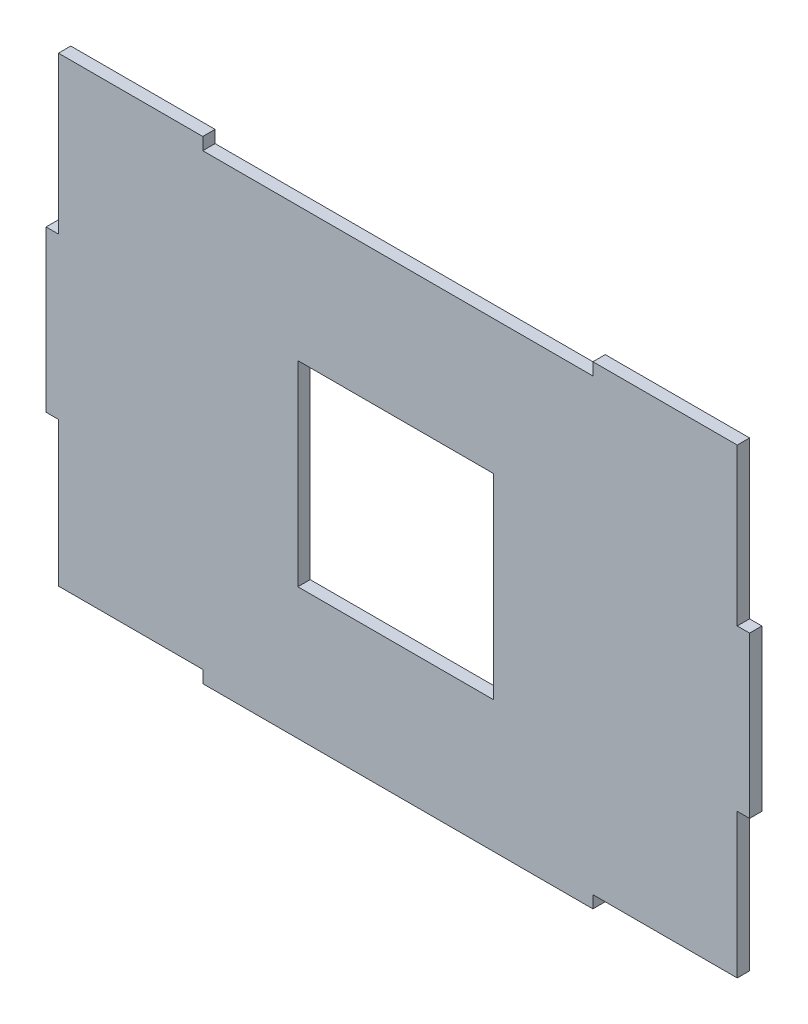
ISO-10303-21;
HEADER;
FILE_DESCRIPTION(('STEP AP214'),'2;1');
FILE_NAME('part.step','',(''),(''),'','','');
FILE_SCHEMA(('AUTOMOTIVE_DESIGN { 1 0 10303 214 1 1 1 1 }'));
ENDSEC;
DATA;
#1=APPLICATION_CONTEXT('core data for automotive mechanical design processes');
#2=APPLICATION_PROTOCOL_DEFINITION('international standard','automotive_design',2000,#1);
#3=PRODUCT_CONTEXT('',#1,'mechanical');
#4=PRODUCT('Part','Part','',(#3));
#5=PRODUCT_RELATED_PRODUCT_CATEGORY('part','',(#4));
#6=PRODUCT_DEFINITION_FORMATION('','',#4);
#7=PRODUCT_DEFINITION_CONTEXT('part definition',#1,'design');
#8=PRODUCT_DEFINITION('design','',#6,#7);
#9=PRODUCT_DEFINITION_SHAPE('','',#8);
#10=(LENGTH_UNIT() NAMED_UNIT(*) SI_UNIT(.MILLI.,.METRE.));
#11=(NAMED_UNIT(*) PLANE_ANGLE_UNIT() SI_UNIT($,.RADIAN.));
#12=(NAMED_UNIT(*) SI_UNIT($,.STERADIAN.) SOLID_ANGLE_UNIT());
#13=UNCERTAINTY_MEASURE_WITH_UNIT(LENGTH_MEASURE(1.E-05),#10,'distance_accuracy_value','');
#14=(GEOMETRIC_REPRESENTATION_CONTEXT(3) GLOBAL_UNCERTAINTY_ASSIGNED_CONTEXT((#13)) GLOBAL_UNIT_ASSIGNED_CONTEXT((#10,
#11,#12)) REPRESENTATION_CONTEXT('',''));
#15=CARTESIAN_POINT('',(0.,0.,0.));
#16=DIRECTION('',(0.,0.,1.));
#17=DIRECTION('',(1.,0.,0.));
#18=AXIS2_PLACEMENT_3D('',#15,#16,#17);
#19=CARTESIAN_POINT('',(0.,0.,2.));
#20=DIRECTION('',(0.,0.,-1.));
#21=DIRECTION('',(-1.,0.,0.));
#22=AXIS2_PLACEMENT_3D('',#19,#20,#21);
#23=PLANE('',#22);
#24=DIRECTION('',(0.,1.,0.));
#25=VECTOR('',#24,1.);
#26=CARTESIAN_POINT('',(55.023,35.465,2.));
#27=LINE('',#26,#25);
#28=CARTESIAN_POINT('',(55.023,12.065,2.));
#29=VERTEX_POINT('',#28);
#30=CARTESIAN_POINT('',(55.023,37.465,2.));
#31=VERTEX_POINT('',#30);
#32=EDGE_CURVE('E253',#29,#31,#27,.T.);
#33=ORIENTED_EDGE('',*,*,#32,.T.);
#34=DIRECTION('',(-1.,0.,0.));
#35=VECTOR('',#34,1.);
#36=CARTESIAN_POINT('',(31.623,37.465,2.));
#37=LINE('',#36,#35);
#38=CARTESIAN_POINT('',(31.623,37.465,2.));
#39=VERTEX_POINT('',#38);
#40=EDGE_CURVE('E257',#31,#39,#37,.T.);
#41=ORIENTED_EDGE('',*,*,#40,.T.);
#42=DIRECTION('',(0.,-1.,0.));
#43=VECTOR('',#42,1.);
#44=CARTESIAN_POINT('',(31.623,37.465,2.));
#45=LINE('',#44,#43);
#46=CARTESIAN_POINT('',(31.623,35.465,2.));
#47=VERTEX_POINT('',#46);
#48=EDGE_CURVE('E261',#39,#47,#45,.T.);
#49=ORIENTED_EDGE('',*,*,#48,.T.);
#50=DIRECTION('',(-1.,0.,0.));
#51=VECTOR('',#50,1.);
#52=CARTESIAN_POINT('',(-31.623,35.465,2.));
#53=LINE('',#52,#51);
#54=CARTESIAN_POINT('',(-31.623,35.465,2.));
#55=VERTEX_POINT('',#54);
#56=EDGE_CURVE('E264',#47,#55,#53,.T.);
#57=ORIENTED_EDGE('',*,*,#56,.T.);
#58=DIRECTION('',(0.,1.,0.));
#59=VECTOR('',#58,1.);
#60=CARTESIAN_POINT('',(-31.623,37.465,2.));
#61=LINE('',#60,#59);
#62=CARTESIAN_POINT('',(-31.623,37.465,2.));
#63=VERTEX_POINT('',#62);
#64=EDGE_CURVE('E267',#55,#63,#61,.T.);
#65=ORIENTED_EDGE('',*,*,#64,.T.);
#66=DIRECTION('',(-1.,0.,0.));
#67=VECTOR('',#66,1.);
#68=CARTESIAN_POINT('',(-55.023,37.465,2.));
#69=LINE('',#68,#67);
#70=CARTESIAN_POINT('',(-55.023,37.465,2.));
#71=VERTEX_POINT('',#70);
#72=EDGE_CURVE('E270',#63,#71,#69,.T.);
#73=ORIENTED_EDGE('',*,*,#72,.T.);
#74=DIRECTION('',(0.,-1.,0.));
#75=VECTOR('',#74,1.);
#76=CARTESIAN_POINT('',(-55.023,35.465,2.));
#77=LINE('',#76,#75);
#78=CARTESIAN_POINT('',(-55.023,12.065,2.));
#79=VERTEX_POINT('',#78);
#80=EDGE_CURVE('E273',#71,#79,#77,.T.);
#81=ORIENTED_EDGE('',*,*,#80,.T.);
#82=DIRECTION('',(-1.,0.,0.));
#83=VECTOR('',#82,1.);
#84=CARTESIAN_POINT('',(-57.023,12.065,2.));
#85=LINE('',#84,#83);
#86=CARTESIAN_POINT('',(-57.023,12.065,2.));
#87=VERTEX_POINT('',#86);
#88=EDGE_CURVE('E276',#79,#87,#85,.T.);
#89=ORIENTED_EDGE('',*,*,#88,.T.);
#90=DIRECTION('',(0.,-1.,0.));
#91=VECTOR('',#90,1.);
#92=CARTESIAN_POINT('',(-57.023,-13.9567253126812,2.));
#93=LINE('',#92,#91);
#94=CARTESIAN_POINT('',(-57.023,-13.9567253126812,2.));
#95=VERTEX_POINT('',#94);
#96=EDGE_CURVE('E279',#87,#95,#93,.T.);
#97=ORIENTED_EDGE('',*,*,#96,.T.);
#98=DIRECTION('',(1.,0.,0.));
#99=VECTOR('',#98,1.);
#100=CARTESIAN_POINT('',(-57.023,-13.9567253126812,2.));
#101=LINE('',#100,#99);
#102=CARTESIAN_POINT('',(-55.023,-13.9567253126812,2.));
#103=VERTEX_POINT('',#102);
#104=EDGE_CURVE('E282',#95,#103,#101,.T.);
#105=ORIENTED_EDGE('',*,*,#104,.T.);
#106=DIRECTION('',(0.,-1.,0.));
#107=VECTOR('',#106,1.);
#108=CARTESIAN_POINT('',(-55.023,-37.3567253126812,2.));
#109=LINE('',#108,#107);
#110=CARTESIAN_POINT('',(-55.023,-37.3567253126812,2.));
#111=VERTEX_POINT('',#110);
#112=EDGE_CURVE('E285',#103,#111,#109,.T.);
#113=ORIENTED_EDGE('',*,*,#112,.T.);
#114=DIRECTION('',(1.,0.,0.));
#115=VECTOR('',#114,1.);
#116=CARTESIAN_POINT('',(-55.023,-37.3567253126812,2.));
#117=LINE('',#116,#115);
#118=CARTESIAN_POINT('',(-31.623,-37.3567253126812,2.));
#119=VERTEX_POINT('',#118);
#120=EDGE_CURVE('E288',#111,#119,#117,.T.);
#121=ORIENTED_EDGE('',*,*,#120,.T.);
#122=DIRECTION('',(0.,-1.,0.));
#123=VECTOR('',#122,1.);
#124=CARTESIAN_POINT('',(-31.623,-37.3567253126812,2.));
#125=LINE('',#124,#123);
#126=CARTESIAN_POINT('',(-31.623,-39.3567253126812,2.));
#127=VERTEX_POINT('',#126);
#128=EDGE_CURVE('E291',#119,#127,#125,.T.);
#129=ORIENTED_EDGE('',*,*,#128,.T.);
#130=DIRECTION('',(1.,0.,0.));
#131=VECTOR('',#130,1.);
#132=CARTESIAN_POINT('',(-31.623,-39.3567253126812,2.));
#133=LINE('',#132,#131);
#134=CARTESIAN_POINT('',(31.623,-39.3567253126812,2.));
#135=VERTEX_POINT('',#134);
#136=EDGE_CURVE('E294',#127,#135,#133,.T.);
#137=ORIENTED_EDGE('',*,*,#136,.T.);
#138=DIRECTION('',(0.,1.,0.));
#139=VECTOR('',#138,1.);
#140=CARTESIAN_POINT('',(31.623,-37.3567253126812,2.));
#141=LINE('',#140,#139);
#142=CARTESIAN_POINT('',(31.623,-37.3567253126812,2.));
#143=VERTEX_POINT('',#142);
#144=EDGE_CURVE('E297',#135,#143,#141,.T.);
#145=ORIENTED_EDGE('',*,*,#144,.T.);
#146=DIRECTION('',(1.,0.,0.));
#147=VECTOR('',#146,1.);
#148=CARTESIAN_POINT('',(31.623,-37.3567253126812,2.));
#149=LINE('',#148,#147);
#150=CARTESIAN_POINT('',(55.023,-37.3567253126812,2.));
#151=VERTEX_POINT('',#150);
#152=EDGE_CURVE('E300',#143,#151,#149,.T.);
#153=ORIENTED_EDGE('',*,*,#152,.T.);
#154=DIRECTION('',(0.,1.,0.));
#155=VECTOR('',#154,1.);
#156=CARTESIAN_POINT('',(55.023,-37.3567253126812,2.));
#157=LINE('',#156,#155);
#158=CARTESIAN_POINT('',(55.023,-13.9567253126812,2.));
#159=VERTEX_POINT('',#158);
#160=EDGE_CURVE('E303',#151,#159,#157,.T.);
#161=ORIENTED_EDGE('',*,*,#160,.T.);
#162=DIRECTION('',(1.,0.,0.));
#163=VECTOR('',#162,1.);
#164=CARTESIAN_POINT('',(55.023,-13.9567253126812,2.));
#165=LINE('',#164,#163);
#166=CARTESIAN_POINT('',(57.023,-13.9567253126812,2.));
#167=VERTEX_POINT('',#166);
#168=EDGE_CURVE('E306',#159,#167,#165,.T.);
#169=ORIENTED_EDGE('',*,*,#168,.T.);
#170=DIRECTION('',(0.,1.,0.));
#171=VECTOR('',#170,1.);
#172=CARTESIAN_POINT('',(57.023,-13.9567253126812,2.));
#173=LINE('',#172,#171);
#174=CARTESIAN_POINT('',(57.023,12.065,2.));
#175=VERTEX_POINT('',#174);
#176=EDGE_CURVE('E309',#167,#175,#173,.T.);
#177=ORIENTED_EDGE('',*,*,#176,.T.);
#178=DIRECTION('',(-1.,0.,0.));
#179=VECTOR('',#178,1.);
#180=CARTESIAN_POINT('',(55.023,12.065,2.));
#181=LINE('',#180,#179);
#182=EDGE_CURVE('E312',#175,#29,#181,.T.);
#183=ORIENTED_EDGE('',*,*,#182,.T.);
#184=EDGE_LOOP('',(#33,#41,#49,#57,#65,#73,#81,#89,#97,#105,#113,#121,#129,#137,#145,#153,#161,
#169,#177,#183));
#185=FACE_BOUND('',#184,.T.);
#186=DIRECTION('',(0.,1.,0.));
#187=VECTOR('',#186,1.);
#188=CARTESIAN_POINT('',(15.5410832674643,-18.0441081163494,2.));
#189=LINE('',#188,#187);
#190=CARTESIAN_POINT('',(15.5410832674643,-18.0441081163494,2.));
#191=VERTEX_POINT('',#190);
#192=CARTESIAN_POINT('',(15.5410832674643,13.7058918836506,2.));
#193=VERTEX_POINT('',#192);
#194=EDGE_CURVE('E205',#191,#193,#189,.T.);
#195=ORIENTED_EDGE('',*,*,#194,.F.);
#196=DIRECTION('',(1.,0.,0.));
#197=VECTOR('',#196,1.);
#198=CARTESIAN_POINT('',(-16.2089167325357,-18.0441081163494,2.));
#199=LINE('',#198,#197);
#200=CARTESIAN_POINT('',(-16.2089167325357,-18.0441081163494,2.));
#201=VERTEX_POINT('',#200);
#202=EDGE_CURVE('E231',#201,#191,#199,.T.);
#203=ORIENTED_EDGE('',*,*,#202,.F.);
#204=DIRECTION('',(0.,-1.,0.));
#205=VECTOR('',#204,1.);
#206=CARTESIAN_POINT('',(-16.2089167325357,-18.0441081163494,2.));
#207=LINE('',#206,#205);
#208=CARTESIAN_POINT('',(-16.2089167325357,13.7058918836506,2.));
#209=VERTEX_POINT('',#208);
#210=EDGE_CURVE('E227',#209,#201,#207,.T.);
#211=ORIENTED_EDGE('',*,*,#210,.F.);
#212=DIRECTION('',(-1.,0.,0.));
#213=VECTOR('',#212,1.);
#214=CARTESIAN_POINT('',(-16.2089167325357,13.7058918836506,2.));
#215=LINE('',#214,#213);
#216=EDGE_CURVE('E214',#193,#209,#215,.T.);
#217=ORIENTED_EDGE('',*,*,#216,.F.);
#218=EDGE_LOOP('',(#195,#203,#211,#217));
#219=FACE_BOUND('',#218,.T.);
#220=ADVANCED_FACE('F43',(#185,#219),#23,.F.);
#221=CARTESIAN_POINT('',(0.,0.,0.));
#222=DIRECTION('',(0.,0.,-1.));
#223=DIRECTION('',(-1.,0.,0.));
#224=AXIS2_PLACEMENT_3D('',#221,#222,#223);
#225=PLANE('',#224);
#226=DIRECTION('',(-1.,0.,0.));
#227=VECTOR('',#226,1.);
#228=CARTESIAN_POINT('',(31.623,37.465,0.));
#229=LINE('',#228,#227);
#230=CARTESIAN_POINT('',(55.023,37.465,0.));
#231=VERTEX_POINT('',#230);
#232=CARTESIAN_POINT('',(31.623,37.465,0.));
#233=VERTEX_POINT('',#232);
#234=EDGE_CURVE('E223',#231,#233,#229,.T.);
#235=ORIENTED_EDGE('',*,*,#234,.F.);
#236=DIRECTION('',(0.,1.,0.));
#237=VECTOR('',#236,1.);
#238=CARTESIAN_POINT('',(55.023,12.065,0.));
#239=LINE('',#238,#237);
#240=CARTESIAN_POINT('',(55.023,12.065,0.));
#241=VERTEX_POINT('',#240);
#242=EDGE_CURVE('E258',#241,#231,#239,.T.);
#243=ORIENTED_EDGE('',*,*,#242,.F.);
#244=DIRECTION('',(-1.,0.,0.));
#245=VECTOR('',#244,1.);
#246=CARTESIAN_POINT('',(55.023,12.065,0.));
#247=LINE('',#246,#245);
#248=CARTESIAN_POINT('',(57.023,12.065,0.));
#249=VERTEX_POINT('',#248);
#250=EDGE_CURVE('E371',#249,#241,#247,.T.);
#251=ORIENTED_EDGE('',*,*,#250,.F.);
#252=DIRECTION('',(0.,1.,0.));
#253=VECTOR('',#252,1.);
#254=CARTESIAN_POINT('',(57.023,-13.9567253126812,0.));
#255=LINE('',#254,#253);
#256=CARTESIAN_POINT('',(57.023,-13.9567253126812,0.));
#257=VERTEX_POINT('',#256);
#258=EDGE_CURVE('E368',#257,#249,#255,.T.);
#259=ORIENTED_EDGE('',*,*,#258,.F.);
#260=DIRECTION('',(1.,0.,0.));
#261=VECTOR('',#260,1.);
#262=CARTESIAN_POINT('',(55.023,-13.9567253126812,0.));
#263=LINE('',#262,#261);
#264=CARTESIAN_POINT('',(55.023,-13.9567253126812,0.));
#265=VERTEX_POINT('',#264);
#266=EDGE_CURVE('E365',#265,#257,#263,.T.);
#267=ORIENTED_EDGE('',*,*,#266,.F.);
#268=DIRECTION('',(0.,1.,0.));
#269=VECTOR('',#268,1.);
#270=CARTESIAN_POINT('',(55.023,-37.3567253126812,0.));
#271=LINE('',#270,#269);
#272=CARTESIAN_POINT('',(55.023,-37.3567253126812,0.));
#273=VERTEX_POINT('',#272);
#274=EDGE_CURVE('E362',#273,#265,#271,.T.);
#275=ORIENTED_EDGE('',*,*,#274,.F.);
#276=DIRECTION('',(1.,0.,0.));
#277=VECTOR('',#276,1.);
#278=CARTESIAN_POINT('',(31.623,-37.3567253126812,0.));
#279=LINE('',#278,#277);
#280=CARTESIAN_POINT('',(31.623,-37.3567253126812,0.));
#281=VERTEX_POINT('',#280);
#282=EDGE_CURVE('E359',#281,#273,#279,.T.);
#283=ORIENTED_EDGE('',*,*,#282,.F.);
#284=DIRECTION('',(0.,1.,0.));
#285=VECTOR('',#284,1.);
#286=CARTESIAN_POINT('',(31.623,-37.3567253126812,0.));
#287=LINE('',#286,#285);
#288=CARTESIAN_POINT('',(31.623,-39.3567253126812,0.));
#289=VERTEX_POINT('',#288);
#290=EDGE_CURVE('E356',#289,#281,#287,.T.);
#291=ORIENTED_EDGE('',*,*,#290,.F.);
#292=DIRECTION('',(1.,0.,0.));
#293=VECTOR('',#292,1.);
#294=CARTESIAN_POINT('',(-31.623,-39.3567253126812,0.));
#295=LINE('',#294,#293);
#296=CARTESIAN_POINT('',(-31.623,-39.3567253126812,0.));
#297=VERTEX_POINT('',#296);
#298=EDGE_CURVE('E353',#297,#289,#295,.T.);
#299=ORIENTED_EDGE('',*,*,#298,.F.);
#300=DIRECTION('',(0.,-1.,0.));
#301=VECTOR('',#300,1.);
#302=CARTESIAN_POINT('',(-31.623,-37.3567253126812,0.));
#303=LINE('',#302,#301);
#304=CARTESIAN_POINT('',(-31.623,-37.3567253126812,0.));
#305=VERTEX_POINT('',#304);
#306=EDGE_CURVE('E350',#305,#297,#303,.T.);
#307=ORIENTED_EDGE('',*,*,#306,.F.);
#308=DIRECTION('',(1.,0.,0.));
#309=VECTOR('',#308,1.);
#310=CARTESIAN_POINT('',(-55.023,-37.3567253126812,0.));
#311=LINE('',#310,#309);
#312=CARTESIAN_POINT('',(-55.023,-37.3567253126812,0.));
#313=VERTEX_POINT('',#312);
#314=EDGE_CURVE('E347',#313,#305,#311,.T.);
#315=ORIENTED_EDGE('',*,*,#314,.F.);
#316=DIRECTION('',(0.,-1.,0.));
#317=VECTOR('',#316,1.);
#318=CARTESIAN_POINT('',(-55.023,-37.3567253126812,0.));
#319=LINE('',#318,#317);
#320=CARTESIAN_POINT('',(-55.023,-13.9567253126812,0.));
#321=VERTEX_POINT('',#320);
#322=EDGE_CURVE('E344',#321,#313,#319,.T.);
#323=ORIENTED_EDGE('',*,*,#322,.F.);
#324=DIRECTION('',(1.,0.,0.));
#325=VECTOR('',#324,1.);
#326=CARTESIAN_POINT('',(-57.023,-13.9567253126812,0.));
#327=LINE('',#326,#325);
#328=CARTESIAN_POINT('',(-57.023,-13.9567253126812,0.));
#329=VERTEX_POINT('',#328);
#330=EDGE_CURVE('E341',#329,#321,#327,.T.);
#331=ORIENTED_EDGE('',*,*,#330,.F.);
#332=DIRECTION('',(0.,-1.,0.));
#333=VECTOR('',#332,1.);
#334=CARTESIAN_POINT('',(-57.023,-13.9567253126812,0.));
#335=LINE('',#334,#333);
#336=CARTESIAN_POINT('',(-57.023,12.065,0.));
#337=VERTEX_POINT('',#336);
#338=EDGE_CURVE('E338',#337,#329,#335,.T.);
#339=ORIENTED_EDGE('',*,*,#338,.F.);
#340=DIRECTION('',(-1.,0.,0.));
#341=VECTOR('',#340,1.);
#342=CARTESIAN_POINT('',(-57.023,12.065,0.));
#343=LINE('',#342,#341);
#344=CARTESIAN_POINT('',(-55.023,12.065,0.));
#345=VERTEX_POINT('',#344);
#346=EDGE_CURVE('E335',#345,#337,#343,.T.);
#347=ORIENTED_EDGE('',*,*,#346,.F.);
#348=DIRECTION('',(0.,-1.,0.));
#349=VECTOR('',#348,1.);
#350=CARTESIAN_POINT('',(-55.023,12.065,0.));
#351=LINE('',#350,#349);
#352=CARTESIAN_POINT('',(-55.023,37.465,0.));
#353=VERTEX_POINT('',#352);
#354=EDGE_CURVE('E332',#353,#345,#351,.T.);
#355=ORIENTED_EDGE('',*,*,#354,.F.);
#356=DIRECTION('',(-1.,0.,0.));
#357=VECTOR('',#356,1.);
#358=CARTESIAN_POINT('',(-55.023,37.465,0.));
#359=LINE('',#358,#357);
#360=CARTESIAN_POINT('',(-31.623,37.465,0.));
#361=VERTEX_POINT('',#360);
#362=EDGE_CURVE('E328',#361,#353,#359,.T.);
#363=ORIENTED_EDGE('',*,*,#362,.F.);
#364=DIRECTION('',(0.,1.,0.));
#365=VECTOR('',#364,1.);
#366=CARTESIAN_POINT('',(-31.623,37.465,0.));
#367=LINE('',#366,#365);
#368=CARTESIAN_POINT('',(-31.623,35.465,0.));
#369=VERTEX_POINT('',#368);
#370=EDGE_CURVE('E325',#369,#361,#367,.T.);
#371=ORIENTED_EDGE('',*,*,#370,.F.);
#372=DIRECTION('',(-1.,0.,0.));
#373=VECTOR('',#372,1.);
#374=CARTESIAN_POINT('',(-31.623,35.465,0.));
#375=LINE('',#374,#373);
#376=CARTESIAN_POINT('',(31.623,35.465,0.));
#377=VERTEX_POINT('',#376);
#378=EDGE_CURVE('E322',#377,#369,#375,.T.);
#379=ORIENTED_EDGE('',*,*,#378,.F.);
#380=DIRECTION('',(0.,-1.,0.));
#381=VECTOR('',#380,1.);
#382=CARTESIAN_POINT('',(31.623,37.465,0.));
#383=LINE('',#382,#381);
#384=EDGE_CURVE('E319',#233,#377,#383,.T.);
#385=ORIENTED_EDGE('',*,*,#384,.F.);
#386=EDGE_LOOP('',(#235,#243,#251,#259,#267,#275,#283,#291,#299,#307,#315,#323,#331,#339,#347,
#355,#363,#371,#379,#385));
#387=FACE_BOUND('',#386,.T.);
#388=DIRECTION('',(1.,0.,0.));
#389=VECTOR('',#388,1.);
#390=CARTESIAN_POINT('',(-16.2089167325357,-18.0441081163494,0.));
#391=LINE('',#390,#389);
#392=CARTESIAN_POINT('',(-16.2089167325357,-18.0441081163494,0.));
#393=VERTEX_POINT('',#392);
#394=CARTESIAN_POINT('',(15.5410832674643,-18.0441081163494,0.));
#395=VERTEX_POINT('',#394);
#396=EDGE_CURVE('E215',#393,#395,#391,.T.);
#397=ORIENTED_EDGE('',*,*,#396,.T.);
#398=DIRECTION('',(0.,1.,0.));
#399=VECTOR('',#398,1.);
#400=CARTESIAN_POINT('',(15.5410832674643,-18.0441081163494,0.));
#401=LINE('',#400,#399);
#402=CARTESIAN_POINT('',(15.5410832674643,13.7058918836506,0.));
#403=VERTEX_POINT('',#402);
#404=EDGE_CURVE('E67',#395,#403,#401,.T.);
#405=ORIENTED_EDGE('',*,*,#404,.T.);
#406=DIRECTION('',(-1.,0.,0.));
#407=VECTOR('',#406,1.);
#408=CARTESIAN_POINT('',(-16.2089167325357,13.7058918836506,0.));
#409=LINE('',#408,#407);
#410=CARTESIAN_POINT('',(-16.2089167325357,13.7058918836506,0.));
#411=VERTEX_POINT('',#410);
#412=EDGE_CURVE('E221',#403,#411,#409,.T.);
#413=ORIENTED_EDGE('',*,*,#412,.T.);
#414=DIRECTION('',(0.,-1.,0.));
#415=VECTOR('',#414,1.);
#416=CARTESIAN_POINT('',(-16.2089167325357,-18.0441081163494,0.));
#417=LINE('',#416,#415);
#418=EDGE_CURVE('E240',#411,#393,#417,.T.);
#419=ORIENTED_EDGE('',*,*,#418,.T.);
#420=EDGE_LOOP('',(#397,#405,#413,#419));
#421=FACE_BOUND('',#420,.T.);
#422=ADVANCED_FACE('F458',(#387,#421),#225,.T.);
#423=CARTESIAN_POINT('',(31.623,37.465,2.));
#424=DIRECTION('',(0.,-1.,0.));
#425=DIRECTION('',(0.,0.,-1.));
#426=AXIS2_PLACEMENT_3D('',#423,#424,#425);
#427=PLANE('',#426);
#428=ORIENTED_EDGE('',*,*,#234,.T.);
#429=DIRECTION('',(0.,0.,-1.));
#430=VECTOR('',#429,1.);
#431=CARTESIAN_POINT('',(31.623,37.465,2.));
#432=LINE('',#431,#430);
#433=EDGE_CURVE('E52',#39,#233,#432,.T.);
#434=ORIENTED_EDGE('',*,*,#433,.F.);
#435=ORIENTED_EDGE('',*,*,#40,.F.);
#436=DIRECTION('',(0.,0.,-1.));
#437=VECTOR('',#436,1.);
#438=CARTESIAN_POINT('',(55.023,37.465,2.));
#439=LINE('',#438,#437);
#440=EDGE_CURVE('E11',#31,#231,#439,.T.);
#441=ORIENTED_EDGE('',*,*,#440,.T.);
#442=EDGE_LOOP('',(#428,#434,#435,#441));
#443=FACE_BOUND('',#442,.T.);
#444=ADVANCED_FACE('F45',(#443),#427,.F.);
#445=CARTESIAN_POINT('',(31.623,37.465,2.));
#446=DIRECTION('',(1.,0.,0.));
#447=DIRECTION('',(0.,1.,0.));
#448=AXIS2_PLACEMENT_3D('',#445,#446,#447);
#449=PLANE('',#448);
#450=ORIENTED_EDGE('',*,*,#384,.T.);
#451=DIRECTION('',(0.,0.,-1.));
#452=VECTOR('',#451,1.);
#453=CARTESIAN_POINT('',(31.623,35.465,2.));
#454=LINE('',#453,#452);
#455=EDGE_CURVE('E443',#47,#377,#454,.T.);
#456=ORIENTED_EDGE('',*,*,#455,.F.);
#457=ORIENTED_EDGE('',*,*,#48,.F.);
#458=ORIENTED_EDGE('',*,*,#433,.T.);
#459=EDGE_LOOP('',(#450,#456,#457,#458));
#460=FACE_BOUND('',#459,.T.);
#461=ADVANCED_FACE('F452',(#460),#449,.F.);
#462=CARTESIAN_POINT('',(-31.623,35.465,2.));
#463=DIRECTION('',(0.,-1.,0.));
#464=DIRECTION('',(0.,0.,-1.));
#465=AXIS2_PLACEMENT_3D('',#462,#463,#464);
#466=PLANE('',#465);
#467=ORIENTED_EDGE('',*,*,#378,.T.);
#468=DIRECTION('',(0.,0.,-1.));
#469=VECTOR('',#468,1.);
#470=CARTESIAN_POINT('',(-31.623,35.465,2.));
#471=LINE('',#470,#469);
#472=EDGE_CURVE('E439',#55,#369,#471,.T.);
#473=ORIENTED_EDGE('',*,*,#472,.F.);
#474=ORIENTED_EDGE('',*,*,#56,.F.);
#475=ORIENTED_EDGE('',*,*,#455,.T.);
#476=EDGE_LOOP('',(#467,#473,#474,#475));
#477=FACE_BOUND('',#476,.T.);
#478=ADVANCED_FACE('F465',(#477),#466,.F.);
#479=CARTESIAN_POINT('',(-31.623,37.465,2.));
#480=DIRECTION('',(-1.,0.,0.));
#481=DIRECTION('',(0.,0.,1.));
#482=AXIS2_PLACEMENT_3D('',#479,#480,#481);
#483=PLANE('',#482);
#484=ORIENTED_EDGE('',*,*,#370,.T.);
#485=DIRECTION('',(0.,0.,-1.));
#486=VECTOR('',#485,1.);
#487=CARTESIAN_POINT('',(-31.623,37.465,2.));
#488=LINE('',#487,#486);
#489=EDGE_CURVE('E435',#63,#361,#488,.T.);
#490=ORIENTED_EDGE('',*,*,#489,.F.);
#491=ORIENTED_EDGE('',*,*,#64,.F.);
#492=ORIENTED_EDGE('',*,*,#472,.T.);
#493=EDGE_LOOP('',(#484,#490,#491,#492));
#494=FACE_BOUND('',#493,.T.);
#495=ADVANCED_FACE('F469',(#494),#483,.F.);
#496=CARTESIAN_POINT('',(-55.023,37.465,2.));
#497=DIRECTION('',(0.,-1.,0.));
#498=DIRECTION('',(0.,0.,-1.));
#499=AXIS2_PLACEMENT_3D('',#496,#497,#498);
#500=PLANE('',#499);
#501=ORIENTED_EDGE('',*,*,#362,.T.);
#502=DIRECTION('',(0.,0.,-1.));
#503=VECTOR('',#502,1.);
#504=CARTESIAN_POINT('',(-55.023,37.465,2.));
#505=LINE('',#504,#503);
#506=EDGE_CURVE('E431',#71,#353,#505,.T.);
#507=ORIENTED_EDGE('',*,*,#506,.F.);
#508=ORIENTED_EDGE('',*,*,#72,.F.);
#509=ORIENTED_EDGE('',*,*,#489,.T.);
#510=EDGE_LOOP('',(#501,#507,#508,#509));
#511=FACE_BOUND('',#510,.T.);
#512=ADVANCED_FACE('F547',(#511),#500,.F.);
#513=CARTESIAN_POINT('',(-55.023,12.065,2.));
#514=DIRECTION('',(1.,0.,0.));
#515=DIRECTION('',(0.,0.,-1.));
#516=AXIS2_PLACEMENT_3D('',#513,#514,#515);
#517=PLANE('',#516);
#518=ORIENTED_EDGE('',*,*,#354,.T.);
#519=DIRECTION('',(0.,0.,-1.));
#520=VECTOR('',#519,1.);
#521=CARTESIAN_POINT('',(-55.023,12.065,2.));
#522=LINE('',#521,#520);
#523=EDGE_CURVE('E427',#79,#345,#522,.T.);
#524=ORIENTED_EDGE('',*,*,#523,.F.);
#525=ORIENTED_EDGE('',*,*,#80,.F.);
#526=ORIENTED_EDGE('',*,*,#506,.T.);
#527=EDGE_LOOP('',(#518,#524,#525,#526));
#528=FACE_BOUND('',#527,.T.);
#529=ADVANCED_FACE('F545',(#528),#517,.F.);
#530=CARTESIAN_POINT('',(-57.023,12.065,2.));
#531=DIRECTION('',(0.,-1.,0.));
#532=DIRECTION('',(0.,0.,-1.));
#533=AXIS2_PLACEMENT_3D('',#530,#531,#532);
#534=PLANE('',#533);
#535=ORIENTED_EDGE('',*,*,#346,.T.);
#536=DIRECTION('',(0.,0.,-1.));
#537=VECTOR('',#536,1.);
#538=CARTESIAN_POINT('',(-57.023,12.065,2.));
#539=LINE('',#538,#537);
#540=EDGE_CURVE('E423',#87,#337,#539,.T.);
#541=ORIENTED_EDGE('',*,*,#540,.F.);
#542=ORIENTED_EDGE('',*,*,#88,.F.);
#543=ORIENTED_EDGE('',*,*,#523,.T.);
#544=EDGE_LOOP('',(#535,#541,#542,#543));
#545=FACE_BOUND('',#544,.T.);
#546=ADVANCED_FACE('F540',(#545),#534,.F.);
#547=CARTESIAN_POINT('',(-57.023,-13.9567253126812,2.));
#548=DIRECTION('',(1.,0.,0.));
#549=DIRECTION('',(0.,1.,0.));
#550=AXIS2_PLACEMENT_3D('',#547,#548,#549);
#551=PLANE('',#550);
#552=ORIENTED_EDGE('',*,*,#338,.T.);
#553=DIRECTION('',(0.,0.,-1.));
#554=VECTOR('',#553,1.);
#555=CARTESIAN_POINT('',(-57.023,-13.9567253126812,2.));
#556=LINE('',#555,#554);
#557=EDGE_CURVE('E419',#95,#329,#556,.T.);
#558=ORIENTED_EDGE('',*,*,#557,.F.);
#559=ORIENTED_EDGE('',*,*,#96,.F.);
#560=ORIENTED_EDGE('',*,*,#540,.T.);
#561=EDGE_LOOP('',(#552,#558,#559,#560));
#562=FACE_BOUND('',#561,.T.);
#563=ADVANCED_FACE('F536',(#562),#551,.F.);
#564=CARTESIAN_POINT('',(-57.023,-13.9567253126812,2.));
#565=DIRECTION('',(0.,1.,0.));
#566=DIRECTION('',(0.,0.,1.));
#567=AXIS2_PLACEMENT_3D('',#564,#565,#566);
#568=PLANE('',#567);
#569=ORIENTED_EDGE('',*,*,#330,.T.);
#570=DIRECTION('',(0.,0.,-1.));
#571=VECTOR('',#570,1.);
#572=CARTESIAN_POINT('',(-55.023,-13.9567253126812,2.));
#573=LINE('',#572,#571);
#574=EDGE_CURVE('E415',#103,#321,#573,.T.);
#575=ORIENTED_EDGE('',*,*,#574,.F.);
#576=ORIENTED_EDGE('',*,*,#104,.F.);
#577=ORIENTED_EDGE('',*,*,#557,.T.);
#578=EDGE_LOOP('',(#569,#575,#576,#577));
#579=FACE_BOUND('',#578,.T.);
#580=ADVANCED_FACE('F532',(#579),#568,.F.);
#581=CARTESIAN_POINT('',(-55.023,-37.3567253126812,2.));
#582=DIRECTION('',(1.,0.,0.));
#583=DIRECTION('',(0.,0.,-1.));
#584=AXIS2_PLACEMENT_3D('',#581,#582,#583);
#585=PLANE('',#584);
#586=ORIENTED_EDGE('',*,*,#322,.T.);
#587=DIRECTION('',(0.,0.,-1.));
#588=VECTOR('',#587,1.);
#589=CARTESIAN_POINT('',(-55.023,-37.3567253126812,2.));
#590=LINE('',#589,#588);
#591=EDGE_CURVE('E411',#111,#313,#590,.T.);
#592=ORIENTED_EDGE('',*,*,#591,.F.);
#593=ORIENTED_EDGE('',*,*,#112,.F.);
#594=ORIENTED_EDGE('',*,*,#574,.T.);
#595=EDGE_LOOP('',(#586,#592,#593,#594));
#596=FACE_BOUND('',#595,.T.);
#597=ADVANCED_FACE('F527',(#596),#585,.F.);
#598=CARTESIAN_POINT('',(-55.023,-37.3567253126812,2.));
#599=DIRECTION('',(0.,1.,0.));
#600=DIRECTION('',(0.,0.,1.));
#601=AXIS2_PLACEMENT_3D('',#598,#599,#600);
#602=PLANE('',#601);
#603=ORIENTED_EDGE('',*,*,#314,.T.);
#604=DIRECTION('',(0.,0.,-1.));
#605=VECTOR('',#604,1.);
#606=CARTESIAN_POINT('',(-31.623,-37.3567253126812,2.));
#607=LINE('',#606,#605);
#608=EDGE_CURVE('E407',#119,#305,#607,.T.);
#609=ORIENTED_EDGE('',*,*,#608,.F.);
#610=ORIENTED_EDGE('',*,*,#120,.F.);
#611=ORIENTED_EDGE('',*,*,#591,.T.);
#612=EDGE_LOOP('',(#603,#609,#610,#611));
#613=FACE_BOUND('',#612,.T.);
#614=ADVANCED_FACE('F521',(#613),#602,.F.);
#615=CARTESIAN_POINT('',(-31.623,-37.3567253126812,2.));
#616=DIRECTION('',(1.,0.,0.));
#617=DIRECTION('',(0.,0.,-1.));
#618=AXIS2_PLACEMENT_3D('',#615,#616,#617);
#619=PLANE('',#618);
#620=ORIENTED_EDGE('',*,*,#306,.T.);
#621=DIRECTION('',(0.,0.,-1.));
#622=VECTOR('',#621,1.);
#623=CARTESIAN_POINT('',(-31.623,-39.3567253126812,2.));
#624=LINE('',#623,#622);
#625=EDGE_CURVE('E403',#127,#297,#624,.T.);
#626=ORIENTED_EDGE('',*,*,#625,.F.);
#627=ORIENTED_EDGE('',*,*,#128,.F.);
#628=ORIENTED_EDGE('',*,*,#608,.T.);
#629=EDGE_LOOP('',(#620,#626,#627,#628));
#630=FACE_BOUND('',#629,.T.);
#631=ADVANCED_FACE('F517',(#630),#619,.F.);
#632=CARTESIAN_POINT('',(-31.623,-39.3567253126812,2.));
#633=DIRECTION('',(0.,1.,0.));
#634=DIRECTION('',(0.,0.,1.));
#635=AXIS2_PLACEMENT_3D('',#632,#633,#634);
#636=PLANE('',#635);
#637=ORIENTED_EDGE('',*,*,#298,.T.);
#638=DIRECTION('',(0.,0.,-1.));
#639=VECTOR('',#638,1.);
#640=CARTESIAN_POINT('',(31.623,-39.3567253126812,2.));
#641=LINE('',#640,#639);
#642=EDGE_CURVE('E399',#135,#289,#641,.T.);
#643=ORIENTED_EDGE('',*,*,#642,.F.);
#644=ORIENTED_EDGE('',*,*,#136,.F.);
#645=ORIENTED_EDGE('',*,*,#625,.T.);
#646=EDGE_LOOP('',(#637,#643,#644,#645));
#647=FACE_BOUND('',#646,.T.);
#648=ADVANCED_FACE('F512',(#647),#636,.F.);
#649=CARTESIAN_POINT('',(31.623,-37.3567253126812,2.));
#650=DIRECTION('',(-1.,0.,0.));
#651=DIRECTION('',(0.,0.,1.));
#652=AXIS2_PLACEMENT_3D('',#649,#650,#651);
#653=PLANE('',#652);
#654=ORIENTED_EDGE('',*,*,#290,.T.);
#655=DIRECTION('',(0.,0.,-1.));
#656=VECTOR('',#655,1.);
#657=CARTESIAN_POINT('',(31.623,-37.3567253126812,2.));
#658=LINE('',#657,#656);
#659=EDGE_CURVE('E395',#143,#281,#658,.T.);
#660=ORIENTED_EDGE('',*,*,#659,.F.);
#661=ORIENTED_EDGE('',*,*,#144,.F.);
#662=ORIENTED_EDGE('',*,*,#642,.T.);
#663=EDGE_LOOP('',(#654,#660,#661,#662));
#664=FACE_BOUND('',#663,.T.);
#665=ADVANCED_FACE('F506',(#664),#653,.F.);
#666=CARTESIAN_POINT('',(31.623,-37.3567253126812,2.));
#667=DIRECTION('',(0.,1.,0.));
#668=DIRECTION('',(0.,0.,1.));
#669=AXIS2_PLACEMENT_3D('',#666,#667,#668);
#670=PLANE('',#669);
#671=ORIENTED_EDGE('',*,*,#282,.T.);
#672=DIRECTION('',(0.,0.,-1.));
#673=VECTOR('',#672,1.);
#674=CARTESIAN_POINT('',(55.023,-37.3567253126812,2.));
#675=LINE('',#674,#673);
#676=EDGE_CURVE('E391',#151,#273,#675,.T.);
#677=ORIENTED_EDGE('',*,*,#676,.F.);
#678=ORIENTED_EDGE('',*,*,#152,.F.);
#679=ORIENTED_EDGE('',*,*,#659,.T.);
#680=EDGE_LOOP('',(#671,#677,#678,#679));
#681=FACE_BOUND('',#680,.T.);
#682=ADVANCED_FACE('F502',(#681),#670,.F.);
#683=CARTESIAN_POINT('',(55.023,-37.3567253126812,2.));
#684=DIRECTION('',(-1.,0.,0.));
#685=DIRECTION('',(0.,0.,1.));
#686=AXIS2_PLACEMENT_3D('',#683,#684,#685);
#687=PLANE('',#686);
#688=ORIENTED_EDGE('',*,*,#274,.T.);
#689=DIRECTION('',(0.,0.,-1.));
#690=VECTOR('',#689,1.);
#691=CARTESIAN_POINT('',(55.023,-13.9567253126812,2.));
#692=LINE('',#691,#690);
#693=EDGE_CURVE('E387',#159,#265,#692,.T.);
#694=ORIENTED_EDGE('',*,*,#693,.F.);
#695=ORIENTED_EDGE('',*,*,#160,.F.);
#696=ORIENTED_EDGE('',*,*,#676,.T.);
#697=EDGE_LOOP('',(#688,#694,#695,#696));
#698=FACE_BOUND('',#697,.T.);
#699=ADVANCED_FACE('F497',(#698),#687,.F.);
#700=CARTESIAN_POINT('',(55.023,-13.9567253126812,2.));
#701=DIRECTION('',(0.,1.,0.));
#702=DIRECTION('',(0.,0.,1.));
#703=AXIS2_PLACEMENT_3D('',#700,#701,#702);
#704=PLANE('',#703);
#705=ORIENTED_EDGE('',*,*,#266,.T.);
#706=DIRECTION('',(0.,0.,-1.));
#707=VECTOR('',#706,1.);
#708=CARTESIAN_POINT('',(57.023,-13.9567253126812,2.));
#709=LINE('',#708,#707);
#710=EDGE_CURVE('E383',#167,#257,#709,.T.);
#711=ORIENTED_EDGE('',*,*,#710,.F.);
#712=ORIENTED_EDGE('',*,*,#168,.F.);
#713=ORIENTED_EDGE('',*,*,#693,.T.);
#714=EDGE_LOOP('',(#705,#711,#712,#713));
#715=FACE_BOUND('',#714,.T.);
#716=ADVANCED_FACE('F491',(#715),#704,.F.);
#717=CARTESIAN_POINT('',(57.023,-13.9567253126812,2.));
#718=DIRECTION('',(-1.,0.,0.));
#719=DIRECTION('',(0.,-1.,0.));
#720=AXIS2_PLACEMENT_3D('',#717,#718,#719);
#721=PLANE('',#720);
#722=ORIENTED_EDGE('',*,*,#258,.T.);
#723=DIRECTION('',(0.,0.,-1.));
#724=VECTOR('',#723,1.);
#725=CARTESIAN_POINT('',(57.023,12.065,2.));
#726=LINE('',#725,#724);
#727=EDGE_CURVE('E379',#175,#249,#726,.T.);
#728=ORIENTED_EDGE('',*,*,#727,.F.);
#729=ORIENTED_EDGE('',*,*,#176,.F.);
#730=ORIENTED_EDGE('',*,*,#710,.T.);
#731=EDGE_LOOP('',(#722,#728,#729,#730));
#732=FACE_BOUND('',#731,.T.);
#733=ADVANCED_FACE('F487',(#732),#721,.F.);
#734=CARTESIAN_POINT('',(55.023,12.065,2.));
#735=DIRECTION('',(0.,-1.,0.));
#736=DIRECTION('',(1.,0.,0.));
#737=AXIS2_PLACEMENT_3D('',#734,#735,#736);
#738=PLANE('',#737);
#739=ORIENTED_EDGE('',*,*,#250,.T.);
#740=DIRECTION('',(0.,0.,-1.));
#741=VECTOR('',#740,1.);
#742=CARTESIAN_POINT('',(55.023,12.065,2.));
#743=LINE('',#742,#741);
#744=EDGE_CURVE('E316',#29,#241,#743,.T.);
#745=ORIENTED_EDGE('',*,*,#744,.F.);
#746=ORIENTED_EDGE('',*,*,#182,.F.);
#747=ORIENTED_EDGE('',*,*,#727,.T.);
#748=EDGE_LOOP('',(#739,#745,#746,#747));
#749=FACE_BOUND('',#748,.T.);
#750=ADVANCED_FACE('F482',(#749),#738,.F.);
#751=CARTESIAN_POINT('',(55.023,12.065,2.));
#752=DIRECTION('',(-1.,0.,0.));
#753=DIRECTION('',(0.,-1.,0.));
#754=AXIS2_PLACEMENT_3D('',#751,#752,#753);
#755=PLANE('',#754);
#756=ORIENTED_EDGE('',*,*,#242,.T.);
#757=ORIENTED_EDGE('',*,*,#440,.F.);
#758=ORIENTED_EDGE('',*,*,#32,.F.);
#759=ORIENTED_EDGE('',*,*,#744,.T.);
#760=EDGE_LOOP('',(#756,#757,#758,#759));
#761=FACE_BOUND('',#760,.T.);
#762=ADVANCED_FACE('F476',(#761),#755,.F.);
#763=CARTESIAN_POINT('',(15.5410832674643,-18.0441081163494,2.));
#764=DIRECTION('',(-1.,0.,0.));
#765=DIRECTION('',(0.,0.,1.));
#766=AXIS2_PLACEMENT_3D('',#763,#764,#765);
#767=PLANE('',#766);
#768=ORIENTED_EDGE('',*,*,#404,.F.);
#769=DIRECTION('',(0.,0.,-1.));
#770=VECTOR('',#769,1.);
#771=CARTESIAN_POINT('',(15.5410832674643,-18.0441081163494,2.));
#772=LINE('',#771,#770);
#773=EDGE_CURVE('E209',#191,#395,#772,.T.);
#774=ORIENTED_EDGE('',*,*,#773,.F.);
#775=ORIENTED_EDGE('',*,*,#194,.T.);
#776=DIRECTION('',(0.,0.,-1.));
#777=VECTOR('',#776,1.);
#778=CARTESIAN_POINT('',(15.5410832674643,13.7058918836506,2.));
#779=LINE('',#778,#777);
#780=EDGE_CURVE('E208',#193,#403,#779,.T.);
#781=ORIENTED_EDGE('',*,*,#780,.T.);
#782=EDGE_LOOP('',(#768,#774,#775,#781));
#783=FACE_BOUND('',#782,.T.);
#784=ADVANCED_FACE('F207',(#783),#767,.T.);
#785=CARTESIAN_POINT('',(-16.2089167325357,13.7058918836506,2.));
#786=DIRECTION('',(0.,-1.,0.));
#787=DIRECTION('',(0.,0.,-1.));
#788=AXIS2_PLACEMENT_3D('',#785,#786,#787);
#789=PLANE('',#788);
#790=ORIENTED_EDGE('',*,*,#412,.F.);
#791=ORIENTED_EDGE('',*,*,#780,.F.);
#792=ORIENTED_EDGE('',*,*,#216,.T.);
#793=DIRECTION('',(0.,0.,-1.));
#794=VECTOR('',#793,1.);
#795=CARTESIAN_POINT('',(-16.2089167325357,13.7058918836506,2.));
#796=LINE('',#795,#794);
#797=EDGE_CURVE('E224',#209,#411,#796,.T.);
#798=ORIENTED_EDGE('',*,*,#797,.T.);
#799=EDGE_LOOP('',(#790,#791,#792,#798));
#800=FACE_BOUND('',#799,.T.);
#801=ADVANCED_FACE('F218',(#800),#789,.T.);
#802=CARTESIAN_POINT('',(-16.2089167325357,-18.0441081163494,2.));
#803=DIRECTION('',(1.,0.,0.));
#804=DIRECTION('',(0.,0.,-1.));
#805=AXIS2_PLACEMENT_3D('',#802,#803,#804);
#806=PLANE('',#805);
#807=ORIENTED_EDGE('',*,*,#418,.F.);
#808=ORIENTED_EDGE('',*,*,#797,.F.);
#809=ORIENTED_EDGE('',*,*,#210,.T.);
#810=DIRECTION('',(0.,0.,-1.));
#811=VECTOR('',#810,1.);
#812=CARTESIAN_POINT('',(-16.2089167325357,-18.0441081163494,2.));
#813=LINE('',#812,#811);
#814=EDGE_CURVE('E59',#201,#393,#813,.T.);
#815=ORIENTED_EDGE('',*,*,#814,.T.);
#816=EDGE_LOOP('',(#807,#808,#809,#815));
#817=FACE_BOUND('',#816,.T.);
#818=ADVANCED_FACE('F659',(#817),#806,.T.);
#819=CARTESIAN_POINT('',(-16.2089167325357,-18.0441081163494,2.));
#820=DIRECTION('',(0.,1.,0.));
#821=DIRECTION('',(0.,0.,1.));
#822=AXIS2_PLACEMENT_3D('',#819,#820,#821);
#823=PLANE('',#822);
#824=ORIENTED_EDGE('',*,*,#396,.F.);
#825=ORIENTED_EDGE('',*,*,#814,.F.);
#826=ORIENTED_EDGE('',*,*,#202,.T.);
#827=ORIENTED_EDGE('',*,*,#773,.T.);
#828=EDGE_LOOP('',(#824,#825,#826,#827));
#829=FACE_BOUND('',#828,.T.);
#830=ADVANCED_FACE('F665',(#829),#823,.T.);
#831=CLOSED_SHELL('',(#220,#422,#444,#461,#478,#495,#512,#529,#546,#563,#580,#597,#614,#631,
#648,#665,#682,#699,#716,#733,#750,#762,#784,#801,#818,#830));
#832=MANIFOLD_SOLID_BREP('B2',#831);
#833=ADVANCED_BREP_SHAPE_REPRESENTATION('',(#18,#832),#14);
#834=SHAPE_DEFINITION_REPRESENTATION(#9,#833);
ENDSEC;
END-ISO-10303-21;
